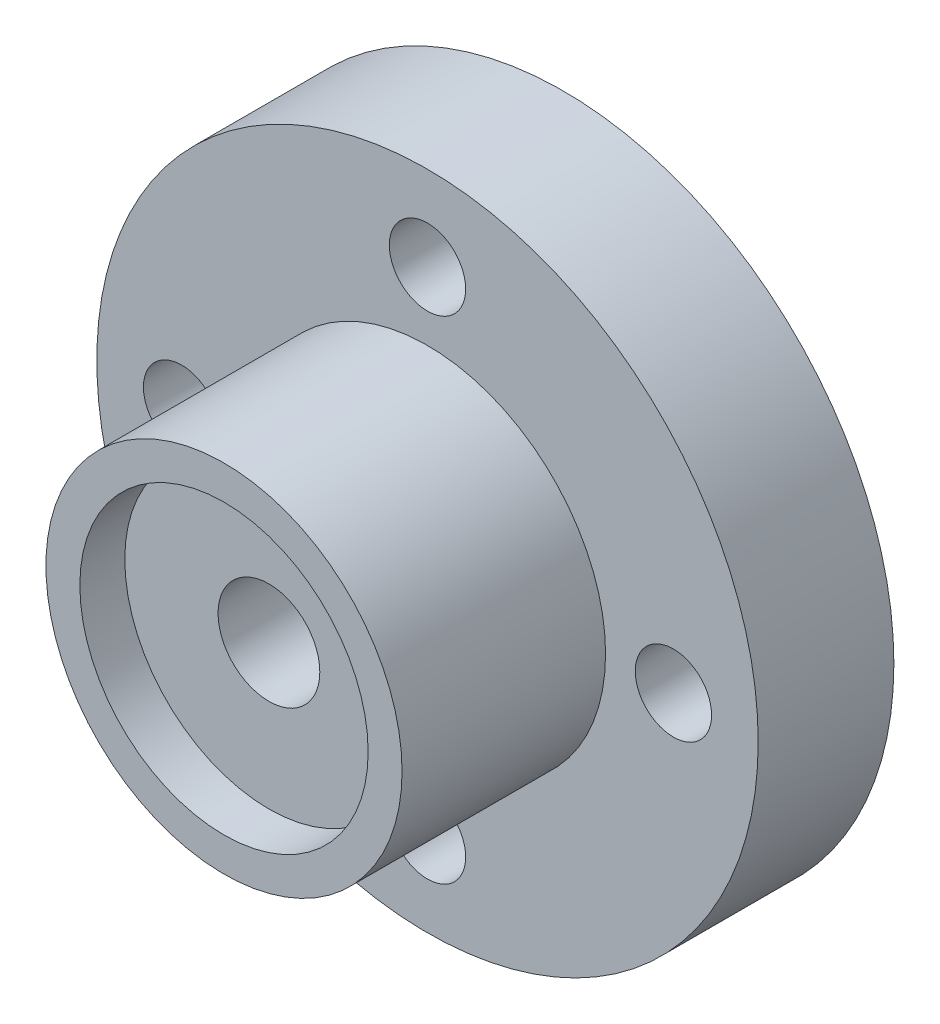
ISO-10303-21;
HEADER;
FILE_DESCRIPTION(('STEP AP214'),'2;1');
FILE_NAME('part.step','',(''),(''),'','','');
FILE_SCHEMA(('AUTOMOTIVE_DESIGN { 1 0 10303 214 1 1 1 1 }'));
ENDSEC;
DATA;
#1=APPLICATION_CONTEXT('core data for automotive mechanical design processes');
#2=APPLICATION_PROTOCOL_DEFINITION('international standard','automotive_design',2000,#1);
#3=PRODUCT_CONTEXT('',#1,'mechanical');
#4=PRODUCT('Part','Part','',(#3));
#5=PRODUCT_RELATED_PRODUCT_CATEGORY('part','',(#4));
#6=PRODUCT_DEFINITION_FORMATION('','',#4);
#7=PRODUCT_DEFINITION_CONTEXT('part definition',#1,'design');
#8=PRODUCT_DEFINITION('design','',#6,#7);
#9=PRODUCT_DEFINITION_SHAPE('','',#8);
#10=(LENGTH_UNIT() NAMED_UNIT(*) SI_UNIT(.MILLI.,.METRE.));
#11=(NAMED_UNIT(*) PLANE_ANGLE_UNIT() SI_UNIT($,.RADIAN.));
#12=(NAMED_UNIT(*) SI_UNIT($,.STERADIAN.) SOLID_ANGLE_UNIT());
#13=UNCERTAINTY_MEASURE_WITH_UNIT(LENGTH_MEASURE(1.E-05),#10,'distance_accuracy_value','');
#14=(GEOMETRIC_REPRESENTATION_CONTEXT(3) GLOBAL_UNCERTAINTY_ASSIGNED_CONTEXT((#13)) GLOBAL_UNIT_ASSIGNED_CONTEXT((#10,
#11,#12)) REPRESENTATION_CONTEXT('',''));
#15=CARTESIAN_POINT('',(0.,0.,0.));
#16=DIRECTION('',(0.,0.,1.));
#17=DIRECTION('',(1.,0.,0.));
#18=AXIS2_PLACEMENT_3D('',#15,#16,#17);
#19=CARTESIAN_POINT('',(0.,0.,0.));
#20=DIRECTION('',(0.,0.,1.));
#21=DIRECTION('',(1.,0.,0.));
#22=AXIS2_PLACEMENT_3D('',#19,#20,#21);
#23=PLANE('',#22);
#24=CARTESIAN_POINT('',(0.,-14.5,0.));
#25=DIRECTION('',(0.,0.,-1.));
#26=DIRECTION('',(-1.,0.,0.));
#27=AXIS2_PLACEMENT_3D('',#24,#25,#26);
#28=CIRCLE('',#27,4.025);
#29=CARTESIAN_POINT('',(-4.025,-14.5,0.));
#30=VERTEX_POINT('',#29);
#31=EDGE_CURVE('E151',#30,#30,#28,.T.);
#32=ORIENTED_EDGE('',*,*,#31,.F.);
#33=EDGE_LOOP('',(#32));
#34=FACE_BOUND('',#33,.T.);
#35=CARTESIAN_POINT('',(-14.5,0.,0.));
#36=DIRECTION('',(0.,0.,-1.));
#37=DIRECTION('',(-1.,0.,0.));
#38=AXIS2_PLACEMENT_3D('',#35,#36,#37);
#39=CIRCLE('',#38,4.025);
#40=CARTESIAN_POINT('',(-18.525,0.,0.));
#41=VERTEX_POINT('',#40);
#42=EDGE_CURVE('E79',#41,#41,#39,.T.);
#43=ORIENTED_EDGE('',*,*,#42,.F.);
#44=EDGE_LOOP('',(#43));
#45=FACE_BOUND('',#44,.T.);
#46=CARTESIAN_POINT('',(0.,14.5,0.));
#47=DIRECTION('',(0.,0.,-1.));
#48=DIRECTION('',(-1.,0.,0.));
#49=AXIS2_PLACEMENT_3D('',#46,#47,#48);
#50=CIRCLE('',#49,4.025);
#51=CARTESIAN_POINT('',(-4.025,14.5,0.));
#52=VERTEX_POINT('',#51);
#53=EDGE_CURVE('E75',#52,#52,#50,.T.);
#54=ORIENTED_EDGE('',*,*,#53,.F.);
#55=EDGE_LOOP('',(#54));
#56=FACE_BOUND('',#55,.T.);
#57=CARTESIAN_POINT('',(0.,0.,0.));
#58=DIRECTION('',(0.,0.,-1.));
#59=DIRECTION('',(-1.,0.,0.));
#60=AXIS2_PLACEMENT_3D('',#57,#58,#59);
#61=CIRCLE('',#60,8.5);
#62=CARTESIAN_POINT('',(-8.5,0.,0.));
#63=VERTEX_POINT('',#62);
#64=EDGE_CURVE('E71',#63,#63,#61,.T.);
#65=ORIENTED_EDGE('',*,*,#64,.F.);
#66=EDGE_LOOP('',(#65));
#67=FACE_BOUND('',#66,.T.);
#68=CARTESIAN_POINT('',(0.,0.,0.));
#69=DIRECTION('',(0.,0.,1.));
#70=DIRECTION('',(1.,0.,0.));
#71=AXIS2_PLACEMENT_3D('',#68,#69,#70);
#72=CIRCLE('',#71,19.5);
#73=CARTESIAN_POINT('',(19.5,0.,0.));
#74=VERTEX_POINT('',#73);
#75=EDGE_CURVE('E51',#74,#74,#72,.T.);
#76=ORIENTED_EDGE('',*,*,#75,.F.);
#77=EDGE_LOOP('',(#76));
#78=FACE_BOUND('',#77,.T.);
#79=CARTESIAN_POINT('',(14.5,1.51879438239676E-13,0.));
#80=DIRECTION('',(0.,0.,-1.));
#81=DIRECTION('',(-1.,0.,0.));
#82=AXIS2_PLACEMENT_3D('',#79,#80,#81);
#83=CIRCLE('',#82,4.025);
#84=CARTESIAN_POINT('',(10.475,1.51879438239676E-13,0.));
#85=VERTEX_POINT('',#84);
#86=EDGE_CURVE('E162',#85,#85,#83,.T.);
#87=ORIENTED_EDGE('',*,*,#86,.F.);
#88=EDGE_LOOP('',(#87));
#89=FACE_BOUND('',#88,.T.);
#90=ADVANCED_FACE('F38',(#34,#45,#56,#67,#78,#89),#23,.F.);
#91=CARTESIAN_POINT('',(0.,0.,20.));
#92=DIRECTION('',(0.,0.,-1.));
#93=DIRECTION('',(-1.,0.,0.));
#94=AXIS2_PLACEMENT_3D('',#91,#92,#93);
#95=CYLINDRICAL_SURFACE('',#94,3.);
#96=CARTESIAN_POINT('',(0.,0.,17.35));
#97=DIRECTION('',(0.,0.,1.));
#98=DIRECTION('',(1.,0.,0.));
#99=AXIS2_PLACEMENT_3D('',#96,#97,#98);
#100=CIRCLE('',#99,3.);
#101=CARTESIAN_POINT('',(3.,0.,17.35));
#102=VERTEX_POINT('',#101);
#103=EDGE_CURVE('E59',#102,#102,#100,.F.);
#104=ORIENTED_EDGE('',*,*,#103,.F.);
#105=EDGE_LOOP('',(#104));
#106=FACE_BOUND('',#105,.T.);
#107=CARTESIAN_POINT('',(0.,0.,2.));
#108=DIRECTION('',(0.,0.,-1.));
#109=DIRECTION('',(-1.,0.,0.));
#110=AXIS2_PLACEMENT_3D('',#107,#108,#109);
#111=CIRCLE('',#110,3.);
#112=CARTESIAN_POINT('',(-3.,0.,2.));
#113=VERTEX_POINT('',#112);
#114=EDGE_CURVE('E63',#113,#113,#111,.F.);
#115=ORIENTED_EDGE('',*,*,#114,.F.);
#116=EDGE_LOOP('',(#115));
#117=FACE_BOUND('',#116,.T.);
#118=ADVANCED_FACE('F141',(#106,#117),#95,.F.);
#119=CARTESIAN_POINT('',(0.,0.,8.));
#120=DIRECTION('',(0.,0.,-1.));
#121=DIRECTION('',(-1.,0.,0.));
#122=AXIS2_PLACEMENT_3D('',#119,#120,#121);
#123=CYLINDRICAL_SURFACE('',#122,19.5);
#124=CARTESIAN_POINT('',(0.,0.,8.));
#125=DIRECTION('',(0.,0.,1.));
#126=DIRECTION('',(1.,0.,0.));
#127=AXIS2_PLACEMENT_3D('',#124,#125,#126);
#128=CIRCLE('',#127,19.5);
#129=CARTESIAN_POINT('',(19.5,0.,8.));
#130=VERTEX_POINT('',#129);
#131=EDGE_CURVE('E46',#130,#130,#128,.T.);
#132=ORIENTED_EDGE('',*,*,#131,.F.);
#133=EDGE_LOOP('',(#132));
#134=FACE_BOUND('',#133,.T.);
#135=ORIENTED_EDGE('',*,*,#75,.T.);
#136=EDGE_LOOP('',(#135));
#137=FACE_BOUND('',#136,.T.);
#138=ADVANCED_FACE('F40',(#134,#137),#123,.T.);
#139=CARTESIAN_POINT('',(0.,0.,8.));
#140=DIRECTION('',(0.,0.,1.));
#141=DIRECTION('',(1.,0.,0.));
#142=AXIS2_PLACEMENT_3D('',#139,#140,#141);
#143=PLANE('',#142);
#144=CARTESIAN_POINT('',(14.5,1.51879438239676E-13,8.));
#145=DIRECTION('',(0.,0.,1.));
#146=DIRECTION('',(1.,0.,0.));
#147=AXIS2_PLACEMENT_3D('',#144,#145,#146);
#148=CIRCLE('',#147,2.25);
#149=CARTESIAN_POINT('',(16.75,1.51879438239676E-13,8.));
#150=VERTEX_POINT('',#149);
#151=EDGE_CURVE('E42',#150,#150,#148,.T.);
#152=ORIENTED_EDGE('',*,*,#151,.F.);
#153=EDGE_LOOP('',(#152));
#154=FACE_BOUND('',#153,.T.);
#155=CARTESIAN_POINT('',(0.,-14.5,8.));
#156=DIRECTION('',(0.,0.,1.));
#157=DIRECTION('',(1.,0.,0.));
#158=AXIS2_PLACEMENT_3D('',#155,#156,#157);
#159=CIRCLE('',#158,2.25);
#160=CARTESIAN_POINT('',(2.25,-14.5,8.));
#161=VERTEX_POINT('',#160);
#162=EDGE_CURVE('E77',#161,#161,#159,.T.);
#163=ORIENTED_EDGE('',*,*,#162,.F.);
#164=EDGE_LOOP('',(#163));
#165=FACE_BOUND('',#164,.T.);
#166=CARTESIAN_POINT('',(-14.5,0.,8.));
#167=DIRECTION('',(0.,0.,1.));
#168=DIRECTION('',(1.,0.,0.));
#169=AXIS2_PLACEMENT_3D('',#166,#167,#168);
#170=CIRCLE('',#169,2.25);
#171=CARTESIAN_POINT('',(-12.25,0.,8.));
#172=VERTEX_POINT('',#171);
#173=EDGE_CURVE('E73',#172,#172,#170,.T.);
#174=ORIENTED_EDGE('',*,*,#173,.F.);
#175=EDGE_LOOP('',(#174));
#176=FACE_BOUND('',#175,.T.);
#177=CARTESIAN_POINT('',(0.,14.5,8.));
#178=DIRECTION('',(0.,0.,1.));
#179=DIRECTION('',(1.,0.,0.));
#180=AXIS2_PLACEMENT_3D('',#177,#178,#179);
#181=CIRCLE('',#180,2.25);
#182=CARTESIAN_POINT('',(2.25,14.5,8.));
#183=VERTEX_POINT('',#182);
#184=EDGE_CURVE('E68',#183,#183,#181,.T.);
#185=ORIENTED_EDGE('',*,*,#184,.F.);
#186=EDGE_LOOP('',(#185));
#187=FACE_BOUND('',#186,.T.);
#188=CARTESIAN_POINT('',(0.,0.,8.));
#189=DIRECTION('',(0.,0.,1.));
#190=DIRECTION('',(1.,0.,0.));
#191=AXIS2_PLACEMENT_3D('',#188,#189,#190);
#192=CIRCLE('',#191,10.5);
#193=CARTESIAN_POINT('',(10.5,0.,8.));
#194=VERTEX_POINT('',#193);
#195=EDGE_CURVE('E10',#194,#194,#192,.T.);
#196=ORIENTED_EDGE('',*,*,#195,.F.);
#197=EDGE_LOOP('',(#196));
#198=FACE_BOUND('',#197,.T.);
#199=ORIENTED_EDGE('',*,*,#131,.T.);
#200=EDGE_LOOP('',(#199));
#201=FACE_BOUND('',#200,.T.);
#202=ADVANCED_FACE('F133',(#154,#165,#176,#187,#198,#201),#143,.T.);
#203=CARTESIAN_POINT('',(0.,0.,20.));
#204=DIRECTION('',(0.,0.,-1.));
#205=DIRECTION('',(-1.,0.,0.));
#206=AXIS2_PLACEMENT_3D('',#203,#204,#205);
#207=CYLINDRICAL_SURFACE('',#206,10.5);
#208=CARTESIAN_POINT('',(0.,0.,20.));
#209=DIRECTION('',(0.,0.,1.));
#210=DIRECTION('',(1.,0.,0.));
#211=AXIS2_PLACEMENT_3D('',#208,#209,#210);
#212=CIRCLE('',#211,10.5);
#213=CARTESIAN_POINT('',(10.5,0.,20.));
#214=VERTEX_POINT('',#213);
#215=EDGE_CURVE('E54',#214,#214,#212,.T.);
#216=ORIENTED_EDGE('',*,*,#215,.F.);
#217=EDGE_LOOP('',(#216));
#218=FACE_BOUND('',#217,.T.);
#219=ORIENTED_EDGE('',*,*,#195,.T.);
#220=EDGE_LOOP('',(#219));
#221=FACE_BOUND('',#220,.T.);
#222=ADVANCED_FACE('F127',(#218,#221),#207,.T.);
#223=CARTESIAN_POINT('',(0.,0.,20.));
#224=DIRECTION('',(0.,0.,1.));
#225=DIRECTION('',(1.,0.,0.));
#226=AXIS2_PLACEMENT_3D('',#223,#224,#225);
#227=PLANE('',#226);
#228=CARTESIAN_POINT('',(0.,0.,20.));
#229=DIRECTION('',(0.,0.,1.));
#230=DIRECTION('',(1.,0.,0.));
#231=AXIS2_PLACEMENT_3D('',#228,#229,#230);
#232=CIRCLE('',#231,8.5);
#233=CARTESIAN_POINT('',(8.5,0.,20.));
#234=VERTEX_POINT('',#233);
#235=EDGE_CURVE('E66',#234,#234,#232,.T.);
#236=ORIENTED_EDGE('',*,*,#235,.F.);
#237=EDGE_LOOP('',(#236));
#238=FACE_BOUND('',#237,.T.);
#239=ORIENTED_EDGE('',*,*,#215,.T.);
#240=EDGE_LOOP('',(#239));
#241=FACE_BOUND('',#240,.T.);
#242=ADVANCED_FACE('F123',(#238,#241),#227,.T.);
#243=CARTESIAN_POINT('',(0.,0.,17.35));
#244=DIRECTION('',(0.,0.,1.));
#245=DIRECTION('',(1.,0.,0.));
#246=AXIS2_PLACEMENT_3D('',#243,#244,#245);
#247=PLANE('',#246);
#248=CARTESIAN_POINT('',(0.,0.,17.35));
#249=DIRECTION('',(0.,0.,1.));
#250=DIRECTION('',(1.,0.,0.));
#251=AXIS2_PLACEMENT_3D('',#248,#249,#250);
#252=CIRCLE('',#251,8.5);
#253=CARTESIAN_POINT('',(8.5,0.,17.35));
#254=VERTEX_POINT('',#253);
#255=EDGE_CURVE('E62',#254,#254,#252,.T.);
#256=ORIENTED_EDGE('',*,*,#255,.T.);
#257=EDGE_LOOP('',(#256));
#258=FACE_BOUND('',#257,.T.);
#259=ORIENTED_EDGE('',*,*,#103,.T.);
#260=EDGE_LOOP('',(#259));
#261=FACE_BOUND('',#260,.T.);
#262=ADVANCED_FACE('F126',(#258,#261),#247,.T.);
#263=CARTESIAN_POINT('',(0.,0.,17.35));
#264=DIRECTION('',(0.,0.,1.));
#265=DIRECTION('',(1.,0.,0.));
#266=AXIS2_PLACEMENT_3D('',#263,#264,#265);
#267=CYLINDRICAL_SURFACE('',#266,8.5);
#268=ORIENTED_EDGE('',*,*,#255,.F.);
#269=EDGE_LOOP('',(#268));
#270=FACE_BOUND('',#269,.T.);
#271=ORIENTED_EDGE('',*,*,#235,.T.);
#272=EDGE_LOOP('',(#271));
#273=FACE_BOUND('',#272,.T.);
#274=ADVANCED_FACE('F121',(#270,#273),#267,.F.);
#275=CARTESIAN_POINT('',(0.,0.,2.));
#276=DIRECTION('',(0.,0.,-1.));
#277=DIRECTION('',(-1.,0.,0.));
#278=AXIS2_PLACEMENT_3D('',#275,#276,#277);
#279=PLANE('',#278);
#280=CARTESIAN_POINT('',(0.,0.,2.));
#281=DIRECTION('',(0.,0.,-1.));
#282=DIRECTION('',(-1.,0.,0.));
#283=AXIS2_PLACEMENT_3D('',#280,#281,#282);
#284=CIRCLE('',#283,8.5);
#285=CARTESIAN_POINT('',(-8.5,0.,2.));
#286=VERTEX_POINT('',#285);
#287=EDGE_CURVE('E67',#286,#286,#284,.T.);
#288=ORIENTED_EDGE('',*,*,#287,.T.);
#289=EDGE_LOOP('',(#288));
#290=FACE_BOUND('',#289,.T.);
#291=ORIENTED_EDGE('',*,*,#114,.T.);
#292=EDGE_LOOP('',(#291));
#293=FACE_BOUND('',#292,.T.);
#294=ADVANCED_FACE('F236',(#290,#293),#279,.T.);
#295=CARTESIAN_POINT('',(0.,0.,2.));
#296=DIRECTION('',(0.,0.,-1.));
#297=DIRECTION('',(-1.,0.,0.));
#298=AXIS2_PLACEMENT_3D('',#295,#296,#297);
#299=CYLINDRICAL_SURFACE('',#298,8.5);
#300=ORIENTED_EDGE('',*,*,#287,.F.);
#301=EDGE_LOOP('',(#300));
#302=FACE_BOUND('',#301,.T.);
#303=ORIENTED_EDGE('',*,*,#64,.T.);
#304=EDGE_LOOP('',(#303));
#305=FACE_BOUND('',#304,.T.);
#306=ADVANCED_FACE('F234',(#302,#305),#299,.F.);
#307=CARTESIAN_POINT('',(0.,14.5,0.));
#308=DIRECTION('',(0.,0.,-1.));
#309=DIRECTION('',(-1.,0.,0.));
#310=AXIS2_PLACEMENT_3D('',#307,#308,#309);
#311=CYLINDRICAL_SURFACE('',#310,2.25);
#312=ORIENTED_EDGE('',*,*,#184,.T.);
#313=EDGE_LOOP('',(#312));
#314=FACE_BOUND('',#313,.T.);
#315=CARTESIAN_POINT('',(0.,14.5,4.6));
#316=DIRECTION('',(0.,0.,-1.));
#317=DIRECTION('',(-1.,0.,0.));
#318=AXIS2_PLACEMENT_3D('',#315,#316,#317);
#319=CIRCLE('',#318,2.25);
#320=CARTESIAN_POINT('',(-2.25,14.5,4.6));
#321=VERTEX_POINT('',#320);
#322=EDGE_CURVE('E72',#321,#321,#319,.T.);
#323=ORIENTED_EDGE('',*,*,#322,.T.);
#324=EDGE_LOOP('',(#323));
#325=FACE_BOUND('',#324,.T.);
#326=ADVANCED_FACE('F230',(#314,#325),#311,.F.);
#327=CARTESIAN_POINT('',(4.,14.5,4.6));
#328=DIRECTION('',(0.,0.,1.));
#329=DIRECTION('',(1.,0.,0.));
#330=AXIS2_PLACEMENT_3D('',#327,#328,#329);
#331=PLANE('',#330);
#332=ORIENTED_EDGE('',*,*,#322,.F.);
#333=EDGE_LOOP('',(#332));
#334=FACE_BOUND('',#333,.T.);
#335=CARTESIAN_POINT('',(0.,14.5,4.6));
#336=DIRECTION('',(0.,0.,-1.));
#337=DIRECTION('',(-1.,0.,0.));
#338=AXIS2_PLACEMENT_3D('',#335,#336,#337);
#339=CIRCLE('',#338,4.);
#340=CARTESIAN_POINT('',(-4.,14.5,4.6));
#341=VERTEX_POINT('',#340);
#342=EDGE_CURVE('E108',#341,#341,#339,.T.);
#343=ORIENTED_EDGE('',*,*,#342,.T.);
#344=EDGE_LOOP('',(#343));
#345=FACE_BOUND('',#344,.T.);
#346=ADVANCED_FACE('F226',(#334,#345),#331,.F.);
#347=CARTESIAN_POINT('',(0.,14.5,0.));
#348=DIRECTION('',(0.,0.,-1.));
#349=DIRECTION('',(-1.,0.,0.));
#350=AXIS2_PLACEMENT_3D('',#347,#348,#349);
#351=CYLINDRICAL_SURFACE('',#350,4.);
#352=ORIENTED_EDGE('',*,*,#342,.F.);
#353=EDGE_LOOP('',(#352));
#354=FACE_BOUND('',#353,.T.);
#355=CARTESIAN_POINT('',(0.,14.5,0.0250000000000003));
#356=DIRECTION('',(0.,0.,-1.));
#357=DIRECTION('',(-1.,0.,0.));
#358=AXIS2_PLACEMENT_3D('',#355,#356,#357);
#359=CIRCLE('',#358,4.);
#360=CARTESIAN_POINT('',(-4.,14.5,0.0250000000000003));
#361=VERTEX_POINT('',#360);
#362=EDGE_CURVE('E105',#361,#361,#359,.T.);
#363=ORIENTED_EDGE('',*,*,#362,.T.);
#364=EDGE_LOOP('',(#363));
#365=FACE_BOUND('',#364,.T.);
#366=ADVANCED_FACE('F222',(#354,#365),#351,.F.);
#367=CARTESIAN_POINT('',(0.,14.5,0.));
#368=DIRECTION('',(0.,0.,-1.));
#369=DIRECTION('',(-1.,0.,0.));
#370=AXIS2_PLACEMENT_3D('',#367,#368,#369);
#371=CONICAL_SURFACE('',#370,4.025,0.78539816339744);
#372=ORIENTED_EDGE('',*,*,#362,.F.);
#373=EDGE_LOOP('',(#372));
#374=FACE_BOUND('',#373,.T.);
#375=ORIENTED_EDGE('',*,*,#53,.T.);
#376=EDGE_LOOP('',(#375));
#377=FACE_BOUND('',#376,.T.);
#378=ADVANCED_FACE('F218',(#374,#377),#371,.F.);
#379=CARTESIAN_POINT('',(-14.5,0.,0.));
#380=DIRECTION('',(0.,0.,-1.));
#381=DIRECTION('',(-1.,0.,0.));
#382=AXIS2_PLACEMENT_3D('',#379,#380,#381);
#383=CYLINDRICAL_SURFACE('',#382,2.25);
#384=ORIENTED_EDGE('',*,*,#173,.T.);
#385=EDGE_LOOP('',(#384));
#386=FACE_BOUND('',#385,.T.);
#387=CARTESIAN_POINT('',(-14.5,0.,4.6));
#388=DIRECTION('',(0.,0.,-1.));
#389=DIRECTION('',(-1.,0.,0.));
#390=AXIS2_PLACEMENT_3D('',#387,#388,#389);
#391=CIRCLE('',#390,2.25);
#392=CARTESIAN_POINT('',(-16.75,0.,4.6));
#393=VERTEX_POINT('',#392);
#394=EDGE_CURVE('E76',#393,#393,#391,.T.);
#395=ORIENTED_EDGE('',*,*,#394,.T.);
#396=EDGE_LOOP('',(#395));
#397=FACE_BOUND('',#396,.T.);
#398=ADVANCED_FACE('F214',(#386,#397),#383,.F.);
#399=CARTESIAN_POINT('',(-10.5,0.,4.6));
#400=DIRECTION('',(0.,0.,1.));
#401=DIRECTION('',(1.,0.,0.));
#402=AXIS2_PLACEMENT_3D('',#399,#400,#401);
#403=PLANE('',#402);
#404=ORIENTED_EDGE('',*,*,#394,.F.);
#405=EDGE_LOOP('',(#404));
#406=FACE_BOUND('',#405,.T.);
#407=CARTESIAN_POINT('',(-14.5,0.,4.6));
#408=DIRECTION('',(0.,0.,-1.));
#409=DIRECTION('',(-1.,0.,0.));
#410=AXIS2_PLACEMENT_3D('',#407,#408,#409);
#411=CIRCLE('',#410,4.);
#412=CARTESIAN_POINT('',(-18.5,0.,4.6));
#413=VERTEX_POINT('',#412);
#414=EDGE_CURVE('E98',#413,#413,#411,.T.);
#415=ORIENTED_EDGE('',*,*,#414,.T.);
#416=EDGE_LOOP('',(#415));
#417=FACE_BOUND('',#416,.T.);
#418=ADVANCED_FACE('F210',(#406,#417),#403,.F.);
#419=CARTESIAN_POINT('',(-14.5,0.,0.));
#420=DIRECTION('',(0.,0.,-1.));
#421=DIRECTION('',(-1.,0.,0.));
#422=AXIS2_PLACEMENT_3D('',#419,#420,#421);
#423=CYLINDRICAL_SURFACE('',#422,4.);
#424=ORIENTED_EDGE('',*,*,#414,.F.);
#425=EDGE_LOOP('',(#424));
#426=FACE_BOUND('',#425,.T.);
#427=CARTESIAN_POINT('',(-14.5,0.,0.0250000000000003));
#428=DIRECTION('',(0.,0.,-1.));
#429=DIRECTION('',(-1.,0.,0.));
#430=AXIS2_PLACEMENT_3D('',#427,#428,#429);
#431=CIRCLE('',#430,4.);
#432=CARTESIAN_POINT('',(-18.5,0.,0.0250000000000003));
#433=VERTEX_POINT('',#432);
#434=EDGE_CURVE('E84',#433,#433,#431,.T.);
#435=ORIENTED_EDGE('',*,*,#434,.T.);
#436=EDGE_LOOP('',(#435));
#437=FACE_BOUND('',#436,.T.);
#438=ADVANCED_FACE('F206',(#426,#437),#423,.F.);
#439=CARTESIAN_POINT('',(-14.5,0.,0.));
#440=DIRECTION('',(0.,0.,-1.));
#441=DIRECTION('',(-1.,0.,0.));
#442=AXIS2_PLACEMENT_3D('',#439,#440,#441);
#443=CONICAL_SURFACE('',#442,4.025,0.785398163397422);
#444=ORIENTED_EDGE('',*,*,#434,.F.);
#445=EDGE_LOOP('',(#444));
#446=FACE_BOUND('',#445,.T.);
#447=ORIENTED_EDGE('',*,*,#42,.T.);
#448=EDGE_LOOP('',(#447));
#449=FACE_BOUND('',#448,.T.);
#450=ADVANCED_FACE('F203',(#446,#449),#443,.F.);
#451=CARTESIAN_POINT('',(0.,-14.5,0.));
#452=DIRECTION('',(0.,0.,-1.));
#453=DIRECTION('',(-1.,0.,0.));
#454=AXIS2_PLACEMENT_3D('',#451,#452,#453);
#455=CYLINDRICAL_SURFACE('',#454,2.25);
#456=ORIENTED_EDGE('',*,*,#162,.T.);
#457=EDGE_LOOP('',(#456));
#458=FACE_BOUND('',#457,.T.);
#459=CARTESIAN_POINT('',(0.,-14.5,4.6));
#460=DIRECTION('',(0.,0.,-1.));
#461=DIRECTION('',(-1.,0.,0.));
#462=AXIS2_PLACEMENT_3D('',#459,#460,#461);
#463=CIRCLE('',#462,2.25);
#464=CARTESIAN_POINT('',(-2.25,-14.5,4.6));
#465=VERTEX_POINT('',#464);
#466=EDGE_CURVE('E80',#465,#465,#463,.T.);
#467=ORIENTED_EDGE('',*,*,#466,.T.);
#468=EDGE_LOOP('',(#467));
#469=FACE_BOUND('',#468,.T.);
#470=ADVANCED_FACE('F199',(#458,#469),#455,.F.);
#471=CARTESIAN_POINT('',(4.,-14.5,4.6));
#472=DIRECTION('',(0.,0.,1.));
#473=DIRECTION('',(1.,0.,0.));
#474=AXIS2_PLACEMENT_3D('',#471,#472,#473);
#475=PLANE('',#474);
#476=ORIENTED_EDGE('',*,*,#466,.F.);
#477=EDGE_LOOP('',(#476));
#478=FACE_BOUND('',#477,.T.);
#479=CARTESIAN_POINT('',(0.,-14.5,4.6));
#480=DIRECTION('',(0.,0.,-1.));
#481=DIRECTION('',(-1.,0.,0.));
#482=AXIS2_PLACEMENT_3D('',#479,#480,#481);
#483=CIRCLE('',#482,4.);
#484=CARTESIAN_POINT('',(-4.,-14.5,4.6));
#485=VERTEX_POINT('',#484);
#486=EDGE_CURVE('E87',#485,#485,#483,.T.);
#487=ORIENTED_EDGE('',*,*,#486,.T.);
#488=EDGE_LOOP('',(#487));
#489=FACE_BOUND('',#488,.T.);
#490=ADVANCED_FACE('F192',(#478,#489),#475,.F.);
#491=CARTESIAN_POINT('',(0.,-14.5,0.));
#492=DIRECTION('',(0.,0.,-1.));
#493=DIRECTION('',(-1.,0.,0.));
#494=AXIS2_PLACEMENT_3D('',#491,#492,#493);
#495=CYLINDRICAL_SURFACE('',#494,4.);
#496=ORIENTED_EDGE('',*,*,#486,.F.);
#497=EDGE_LOOP('',(#496));
#498=FACE_BOUND('',#497,.T.);
#499=CARTESIAN_POINT('',(0.,-14.5,0.0250000000000003));
#500=DIRECTION('',(0.,0.,-1.));
#501=DIRECTION('',(-1.,0.,0.));
#502=AXIS2_PLACEMENT_3D('',#499,#500,#501);
#503=CIRCLE('',#502,4.);
#504=CARTESIAN_POINT('',(-4.,-14.5,0.0250000000000003));
#505=VERTEX_POINT('',#504);
#506=EDGE_CURVE('E92',#505,#505,#503,.T.);
#507=ORIENTED_EDGE('',*,*,#506,.T.);
#508=EDGE_LOOP('',(#507));
#509=FACE_BOUND('',#508,.T.);
#510=ADVANCED_FACE('F178',(#498,#509),#495,.F.);
#511=CARTESIAN_POINT('',(0.,-14.5,0.));
#512=DIRECTION('',(0.,0.,-1.));
#513=DIRECTION('',(-1.,0.,0.));
#514=AXIS2_PLACEMENT_3D('',#511,#512,#513);
#515=CONICAL_SURFACE('',#514,4.025,0.78539816339744);
#516=ORIENTED_EDGE('',*,*,#506,.F.);
#517=EDGE_LOOP('',(#516));
#518=FACE_BOUND('',#517,.T.);
#519=ORIENTED_EDGE('',*,*,#31,.T.);
#520=EDGE_LOOP('',(#519));
#521=FACE_BOUND('',#520,.T.);
#522=ADVANCED_FACE('F180',(#518,#521),#515,.F.);
#523=CARTESIAN_POINT('',(14.5,1.51879438239676E-13,0.));
#524=DIRECTION('',(0.,0.,-1.));
#525=DIRECTION('',(-1.,0.,0.));
#526=AXIS2_PLACEMENT_3D('',#523,#524,#525);
#527=CYLINDRICAL_SURFACE('',#526,2.25);
#528=ORIENTED_EDGE('',*,*,#151,.T.);
#529=EDGE_LOOP('',(#528));
#530=FACE_BOUND('',#529,.T.);
#531=CARTESIAN_POINT('',(14.5,1.51879438239676E-13,4.6));
#532=DIRECTION('',(0.,0.,-1.));
#533=DIRECTION('',(-1.,0.,0.));
#534=AXIS2_PLACEMENT_3D('',#531,#532,#533);
#535=CIRCLE('',#534,2.25);
#536=CARTESIAN_POINT('',(12.25,1.51879438239676E-13,4.6));
#537=VERTEX_POINT('',#536);
#538=EDGE_CURVE('E172',#537,#537,#535,.T.);
#539=ORIENTED_EDGE('',*,*,#538,.T.);
#540=EDGE_LOOP('',(#539));
#541=FACE_BOUND('',#540,.T.);
#542=ADVANCED_FACE('F183',(#530,#541),#527,.F.);
#543=CARTESIAN_POINT('',(18.5,1.51879438239676E-13,4.6));
#544=DIRECTION('',(0.,0.,1.));
#545=DIRECTION('',(1.,0.,0.));
#546=AXIS2_PLACEMENT_3D('',#543,#544,#545);
#547=PLANE('',#546);
#548=ORIENTED_EDGE('',*,*,#538,.F.);
#549=EDGE_LOOP('',(#548));
#550=FACE_BOUND('',#549,.T.);
#551=CARTESIAN_POINT('',(14.5,1.51879438239676E-13,4.6));
#552=DIRECTION('',(0.,0.,-1.));
#553=DIRECTION('',(-1.,0.,0.));
#554=AXIS2_PLACEMENT_3D('',#551,#552,#553);
#555=CIRCLE('',#554,4.);
#556=CARTESIAN_POINT('',(10.5,1.51879438239676E-13,4.6));
#557=VERTEX_POINT('',#556);
#558=EDGE_CURVE('E167',#557,#557,#555,.T.);
#559=ORIENTED_EDGE('',*,*,#558,.T.);
#560=EDGE_LOOP('',(#559));
#561=FACE_BOUND('',#560,.T.);
#562=ADVANCED_FACE('F189',(#550,#561),#547,.F.);
#563=CARTESIAN_POINT('',(14.5,1.51879438239676E-13,0.));
#564=DIRECTION('',(0.,0.,-1.));
#565=DIRECTION('',(-1.,0.,0.));
#566=AXIS2_PLACEMENT_3D('',#563,#564,#565);
#567=CYLINDRICAL_SURFACE('',#566,4.);
#568=ORIENTED_EDGE('',*,*,#558,.F.);
#569=EDGE_LOOP('',(#568));
#570=FACE_BOUND('',#569,.T.);
#571=CARTESIAN_POINT('',(14.5,1.51879438239676E-13,0.0250000000000003));
#572=DIRECTION('',(0.,0.,-1.));
#573=DIRECTION('',(-1.,0.,0.));
#574=AXIS2_PLACEMENT_3D('',#571,#572,#573);
#575=CIRCLE('',#574,4.);
#576=CARTESIAN_POINT('',(10.5,1.51879438239676E-13,0.0250000000000003));
#577=VERTEX_POINT('',#576);
#578=EDGE_CURVE('E164',#577,#577,#575,.T.);
#579=ORIENTED_EDGE('',*,*,#578,.T.);
#580=EDGE_LOOP('',(#579));
#581=FACE_BOUND('',#580,.T.);
#582=ADVANCED_FACE('F334',(#570,#581),#567,.F.);
#583=CARTESIAN_POINT('',(14.5,1.51879438239676E-13,0.));
#584=DIRECTION('',(0.,0.,-1.));
#585=DIRECTION('',(-1.,0.,0.));
#586=AXIS2_PLACEMENT_3D('',#583,#584,#585);
#587=CONICAL_SURFACE('',#586,4.025,0.785398163397388);
#588=ORIENTED_EDGE('',*,*,#578,.F.);
#589=EDGE_LOOP('',(#588));
#590=FACE_BOUND('',#589,.T.);
#591=ORIENTED_EDGE('',*,*,#86,.T.);
#592=EDGE_LOOP('',(#591));
#593=FACE_BOUND('',#592,.T.);
#594=ADVANCED_FACE('F344',(#590,#593),#587,.F.);
#595=CLOSED_SHELL('',(#90,#118,#138,#202,#222,#242,#262,#274,#294,#306,#326,#346,#366,#378,#398,
#418,#438,#450,#470,#490,#510,#522,#542,#562,#582,#594));
#596=MANIFOLD_SOLID_BREP('B2',#595);
#597=ADVANCED_BREP_SHAPE_REPRESENTATION('',(#18,#596),#14);
#598=SHAPE_DEFINITION_REPRESENTATION(#9,#597);
ENDSEC;
END-ISO-10303-21;
